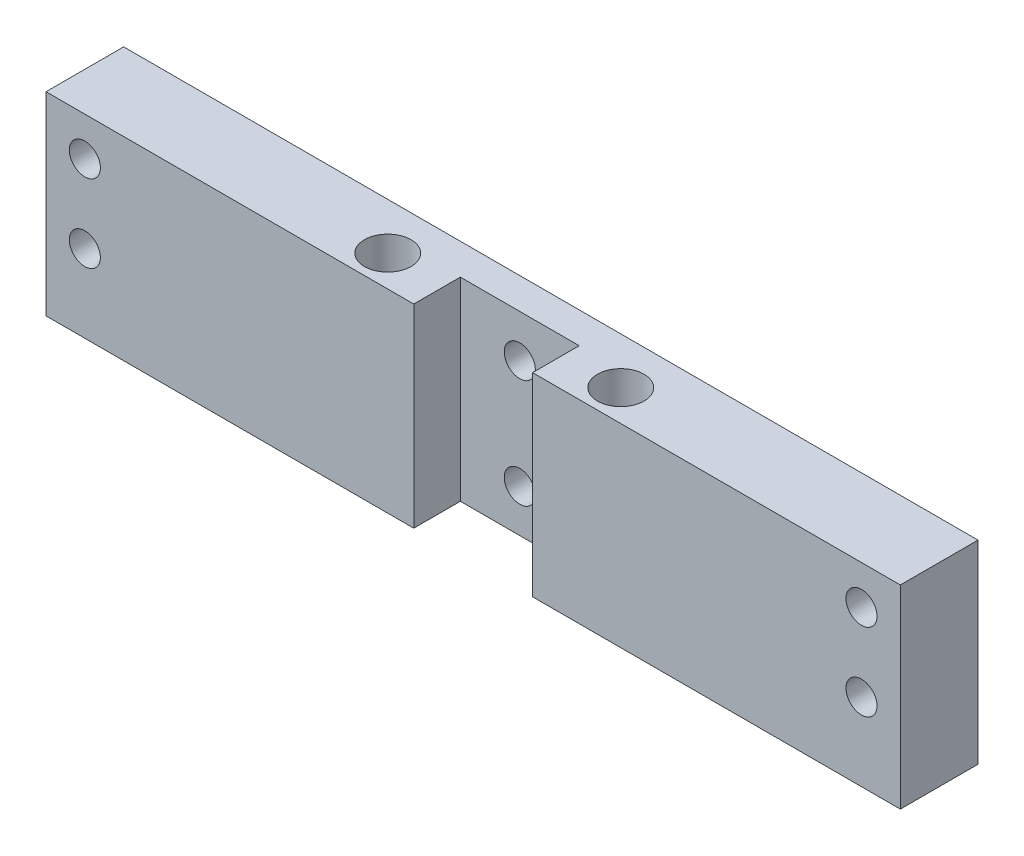
ISO-10303-21;
HEADER;
FILE_DESCRIPTION(('STEP AP214'),'2;1');
FILE_NAME('part.step','',(''),(''),'','','');
FILE_SCHEMA(('AUTOMOTIVE_DESIGN { 1 0 10303 214 1 1 1 1 }'));
ENDSEC;
DATA;
#1=APPLICATION_CONTEXT('core data for automotive mechanical design processes');
#2=APPLICATION_PROTOCOL_DEFINITION('international standard','automotive_design',2000,#1);
#3=PRODUCT_CONTEXT('',#1,'mechanical');
#4=PRODUCT('Part','Part','',(#3));
#5=PRODUCT_RELATED_PRODUCT_CATEGORY('part','',(#4));
#6=PRODUCT_DEFINITION_FORMATION('','',#4);
#7=PRODUCT_DEFINITION_CONTEXT('part definition',#1,'design');
#8=PRODUCT_DEFINITION('design','',#6,#7);
#9=PRODUCT_DEFINITION_SHAPE('','',#8);
#10=(LENGTH_UNIT() NAMED_UNIT(*) SI_UNIT(.MILLI.,.METRE.));
#11=(NAMED_UNIT(*) PLANE_ANGLE_UNIT() SI_UNIT($,.RADIAN.));
#12=(NAMED_UNIT(*) SI_UNIT($,.STERADIAN.) SOLID_ANGLE_UNIT());
#13=UNCERTAINTY_MEASURE_WITH_UNIT(LENGTH_MEASURE(1.E-05),#10,'distance_accuracy_value','');
#14=(GEOMETRIC_REPRESENTATION_CONTEXT(3) GLOBAL_UNCERTAINTY_ASSIGNED_CONTEXT((#13)) GLOBAL_UNIT_ASSIGNED_CONTEXT((#10,
#11,#12)) REPRESENTATION_CONTEXT('',''));
#15=CARTESIAN_POINT('',(0.,0.,0.));
#16=DIRECTION('',(0.,0.,1.));
#17=DIRECTION('',(1.,0.,0.));
#18=AXIS2_PLACEMENT_3D('',#15,#16,#17);
#19=CARTESIAN_POINT('',(0.,0.,10.));
#20=DIRECTION('',(0.,0.,-1.));
#21=DIRECTION('',(-1.,0.,0.));
#22=AXIS2_PLACEMENT_3D('',#19,#20,#21);
#23=PLANE('',#22);
#24=CARTESIAN_POINT('',(5.,10.,10.));
#25=DIRECTION('',(0.,0.,1.));
#26=DIRECTION('',(1.,0.,0.));
#27=AXIS2_PLACEMENT_3D('',#24,#25,#26);
#28=CIRCLE('',#27,2.);
#29=CARTESIAN_POINT('',(7.,10.,10.));
#30=VERTEX_POINT('',#29);
#31=EDGE_CURVE('E162',#30,#30,#28,.T.);
#32=ORIENTED_EDGE('',*,*,#31,.F.);
#33=EDGE_LOOP('',(#32));
#34=FACE_BOUND('',#33,.T.);
#35=CARTESIAN_POINT('',(5.,20.,10.));
#36=DIRECTION('',(0.,0.,1.));
#37=DIRECTION('',(1.,0.,0.));
#38=AXIS2_PLACEMENT_3D('',#35,#36,#37);
#39=CIRCLE('',#38,2.);
#40=CARTESIAN_POINT('',(7.,20.,10.));
#41=VERTEX_POINT('',#40);
#42=EDGE_CURVE('E168',#41,#41,#39,.T.);
#43=ORIENTED_EDGE('',*,*,#42,.F.);
#44=EDGE_LOOP('',(#43));
#45=FACE_BOUND('',#44,.T.);
#46=DIRECTION('',(1.,0.,0.));
#47=VECTOR('',#46,1.);
#48=CARTESIAN_POINT('',(0.,0.,10.));
#49=LINE('',#48,#47);
#50=CARTESIAN_POINT('',(0.,0.,10.));
#51=VERTEX_POINT('',#50);
#52=CARTESIAN_POINT('',(47.35,0.,10.));
#53=VERTEX_POINT('',#52);
#54=EDGE_CURVE('E86',#51,#53,#49,.T.);
#55=ORIENTED_EDGE('',*,*,#54,.T.);
#56=DIRECTION('',(0.,-1.,0.));
#57=VECTOR('',#56,1.);
#58=CARTESIAN_POINT('',(47.35,25.,10.));
#59=LINE('',#58,#57);
#60=CARTESIAN_POINT('',(47.35,25.,10.));
#61=VERTEX_POINT('',#60);
#62=EDGE_CURVE('E112',#61,#53,#59,.T.);
#63=ORIENTED_EDGE('',*,*,#62,.F.);
#64=DIRECTION('',(-1.,0.,0.));
#65=VECTOR('',#64,1.);
#66=CARTESIAN_POINT('',(0.,25.,10.));
#67=LINE('',#66,#65);
#68=CARTESIAN_POINT('',(0.,25.,10.));
#69=VERTEX_POINT('',#68);
#70=EDGE_CURVE('E57',#61,#69,#67,.T.);
#71=ORIENTED_EDGE('',*,*,#70,.T.);
#72=DIRECTION('',(0.,-1.,0.));
#73=VECTOR('',#72,1.);
#74=CARTESIAN_POINT('',(0.,0.,10.));
#75=LINE('',#74,#73);
#76=EDGE_CURVE('E174',#69,#51,#75,.T.);
#77=ORIENTED_EDGE('',*,*,#76,.T.);
#78=EDGE_LOOP('',(#55,#63,#71,#77));
#79=FACE_BOUND('',#78,.T.);
#80=ADVANCED_FACE('F32',(#34,#45,#79),#23,.F.);
#81=CARTESIAN_POINT('',(55.,19.5,10.));
#82=DIRECTION('',(0.,0.,-1.));
#83=DIRECTION('',(-1.,0.,0.));
#84=AXIS2_PLACEMENT_3D('',#81,#82,#83);
#85=CYLINDRICAL_SURFACE('',#84,2.);
#86=CARTESIAN_POINT('',(55.,19.5,0.));
#87=DIRECTION('',(0.,0.,1.));
#88=DIRECTION('',(1.,0.,0.));
#89=AXIS2_PLACEMENT_3D('',#86,#87,#88);
#90=CIRCLE('',#89,2.);
#91=CARTESIAN_POINT('',(57.,19.5,0.));
#92=VERTEX_POINT('',#91);
#93=EDGE_CURVE('E146',#92,#92,#90,.T.);
#94=ORIENTED_EDGE('',*,*,#93,.F.);
#95=EDGE_LOOP('',(#94));
#96=FACE_BOUND('',#95,.T.);
#97=CARTESIAN_POINT('',(55.,19.5,4.));
#98=DIRECTION('',(0.,0.,1.));
#99=DIRECTION('',(1.,0.,0.));
#100=AXIS2_PLACEMENT_3D('',#97,#98,#99);
#101=CIRCLE('',#100,2.);
#102=CARTESIAN_POINT('',(57.,19.5,4.));
#103=VERTEX_POINT('',#102);
#104=EDGE_CURVE('E140',#103,#103,#101,.T.);
#105=ORIENTED_EDGE('',*,*,#104,.T.);
#106=EDGE_LOOP('',(#105));
#107=FACE_BOUND('',#106,.T.);
#108=ADVANCED_FACE('F210',(#96,#107),#85,.F.);
#109=CARTESIAN_POINT('',(55.,5.5,10.));
#110=DIRECTION('',(0.,0.,-1.));
#111=DIRECTION('',(-1.,0.,0.));
#112=AXIS2_PLACEMENT_3D('',#109,#110,#111);
#113=CYLINDRICAL_SURFACE('',#112,2.);
#114=CARTESIAN_POINT('',(55.,5.5,0.));
#115=DIRECTION('',(0.,0.,1.));
#116=DIRECTION('',(1.,0.,0.));
#117=AXIS2_PLACEMENT_3D('',#114,#115,#116);
#118=CIRCLE('',#117,2.);
#119=CARTESIAN_POINT('',(57.,5.5,0.));
#120=VERTEX_POINT('',#119);
#121=EDGE_CURVE('E143',#120,#120,#118,.T.);
#122=ORIENTED_EDGE('',*,*,#121,.F.);
#123=EDGE_LOOP('',(#122));
#124=FACE_BOUND('',#123,.T.);
#125=CARTESIAN_POINT('',(55.,5.5,4.));
#126=DIRECTION('',(0.,0.,1.));
#127=DIRECTION('',(1.,0.,0.));
#128=AXIS2_PLACEMENT_3D('',#125,#126,#127);
#129=CIRCLE('',#128,2.);
#130=CARTESIAN_POINT('',(57.,5.5,4.));
#131=VERTEX_POINT('',#130);
#132=EDGE_CURVE('E36',#131,#131,#129,.T.);
#133=ORIENTED_EDGE('',*,*,#132,.T.);
#134=EDGE_LOOP('',(#133));
#135=FACE_BOUND('',#134,.T.);
#136=ADVANCED_FACE('F217',(#124,#135),#113,.F.);
#137=CARTESIAN_POINT('',(110.,25.,10.));
#138=VERTEX_POINT('',#137);
#139=CARTESIAN_POINT('',(62.65,25.,10.));
#140=VERTEX_POINT('',#139);
#141=EDGE_CURVE('E180',#138,#140,#67,.T.);
#142=ORIENTED_EDGE('',*,*,#141,.T.);
#143=DIRECTION('',(0.,1.,0.));
#144=VECTOR('',#143,1.);
#145=CARTESIAN_POINT('',(62.65,25.,10.));
#146=LINE('',#145,#144);
#147=CARTESIAN_POINT('',(62.65,0.,10.));
#148=VERTEX_POINT('',#147);
#149=EDGE_CURVE('E122',#148,#140,#146,.T.);
#150=ORIENTED_EDGE('',*,*,#149,.F.);
#151=CARTESIAN_POINT('',(110.,0.,10.));
#152=VERTEX_POINT('',#151);
#153=EDGE_CURVE('E176',#148,#152,#49,.T.);
#154=ORIENTED_EDGE('',*,*,#153,.T.);
#155=DIRECTION('',(0.,1.,0.));
#156=VECTOR('',#155,1.);
#157=CARTESIAN_POINT('',(110.,0.,10.));
#158=LINE('',#157,#156);
#159=EDGE_CURVE('E178',#152,#138,#158,.T.);
#160=ORIENTED_EDGE('',*,*,#159,.T.);
#161=EDGE_LOOP('',(#142,#150,#154,#160));
#162=FACE_BOUND('',#161,.T.);
#163=CARTESIAN_POINT('',(105.,20.,10.));
#164=DIRECTION('',(0.,0.,1.));
#165=DIRECTION('',(1.,0.,0.));
#166=AXIS2_PLACEMENT_3D('',#163,#164,#165);
#167=CIRCLE('',#166,2.);
#168=CARTESIAN_POINT('',(107.,20.,10.));
#169=VERTEX_POINT('',#168);
#170=EDGE_CURVE('E156',#169,#169,#167,.T.);
#171=ORIENTED_EDGE('',*,*,#170,.F.);
#172=EDGE_LOOP('',(#171));
#173=FACE_BOUND('',#172,.T.);
#174=CARTESIAN_POINT('',(105.,10.,10.));
#175=DIRECTION('',(0.,0.,1.));
#176=DIRECTION('',(1.,0.,0.));
#177=AXIS2_PLACEMENT_3D('',#174,#175,#176);
#178=CIRCLE('',#177,2.);
#179=CARTESIAN_POINT('',(107.,10.,10.));
#180=VERTEX_POINT('',#179);
#181=EDGE_CURVE('E150',#180,#180,#178,.T.);
#182=ORIENTED_EDGE('',*,*,#181,.F.);
#183=EDGE_LOOP('',(#182));
#184=FACE_BOUND('',#183,.T.);
#185=ADVANCED_FACE('F213',(#162,#173,#184),#23,.F.);
#186=CARTESIAN_POINT('',(0.,0.,0.));
#187=DIRECTION('',(0.,0.,-1.));
#188=DIRECTION('',(-1.,0.,0.));
#189=AXIS2_PLACEMENT_3D('',#186,#187,#188);
#190=PLANE('',#189);
#191=ORIENTED_EDGE('',*,*,#93,.T.);
#192=EDGE_LOOP('',(#191));
#193=FACE_BOUND('',#192,.T.);
#194=CARTESIAN_POINT('',(105.,20.,0.));
#195=DIRECTION('',(0.,0.,1.));
#196=DIRECTION('',(1.,0.,0.));
#197=AXIS2_PLACEMENT_3D('',#194,#195,#196);
#198=CIRCLE('',#197,2.);
#199=CARTESIAN_POINT('',(107.,20.,0.));
#200=VERTEX_POINT('',#199);
#201=EDGE_CURVE('E153',#200,#200,#198,.T.);
#202=ORIENTED_EDGE('',*,*,#201,.T.);
#203=EDGE_LOOP('',(#202));
#204=FACE_BOUND('',#203,.T.);
#205=CARTESIAN_POINT('',(5.,20.,0.));
#206=DIRECTION('',(0.,0.,1.));
#207=DIRECTION('',(1.,0.,0.));
#208=AXIS2_PLACEMENT_3D('',#205,#206,#207);
#209=CIRCLE('',#208,2.);
#210=CARTESIAN_POINT('',(7.,20.,0.));
#211=VERTEX_POINT('',#210);
#212=EDGE_CURVE('E165',#211,#211,#209,.T.);
#213=ORIENTED_EDGE('',*,*,#212,.T.);
#214=EDGE_LOOP('',(#213));
#215=FACE_BOUND('',#214,.T.);
#216=DIRECTION('',(0.,-1.,0.));
#217=VECTOR('',#216,1.);
#218=CARTESIAN_POINT('',(0.,0.,0.));
#219=LINE('',#218,#217);
#220=CARTESIAN_POINT('',(0.,25.,0.));
#221=VERTEX_POINT('',#220);
#222=CARTESIAN_POINT('',(0.,0.,0.));
#223=VERTEX_POINT('',#222);
#224=EDGE_CURVE('E171',#221,#223,#219,.T.);
#225=ORIENTED_EDGE('',*,*,#224,.F.);
#226=DIRECTION('',(-1.,0.,0.));
#227=VECTOR('',#226,1.);
#228=CARTESIAN_POINT('',(0.,25.,0.));
#229=LINE('',#228,#227);
#230=CARTESIAN_POINT('',(110.,25.,0.));
#231=VERTEX_POINT('',#230);
#232=EDGE_CURVE('E79',#231,#221,#229,.T.);
#233=ORIENTED_EDGE('',*,*,#232,.F.);
#234=DIRECTION('',(0.,1.,0.));
#235=VECTOR('',#234,1.);
#236=CARTESIAN_POINT('',(110.,0.,0.));
#237=LINE('',#236,#235);
#238=CARTESIAN_POINT('',(110.,0.,0.));
#239=VERTEX_POINT('',#238);
#240=EDGE_CURVE('E188',#239,#231,#237,.T.);
#241=ORIENTED_EDGE('',*,*,#240,.F.);
#242=DIRECTION('',(1.,0.,0.));
#243=VECTOR('',#242,1.);
#244=CARTESIAN_POINT('',(0.,0.,0.));
#245=LINE('',#244,#243);
#246=EDGE_CURVE('E186',#223,#239,#245,.T.);
#247=ORIENTED_EDGE('',*,*,#246,.F.);
#248=EDGE_LOOP('',(#225,#233,#241,#247));
#249=FACE_BOUND('',#248,.T.);
#250=CARTESIAN_POINT('',(5.,10.,0.));
#251=DIRECTION('',(0.,0.,1.));
#252=DIRECTION('',(1.,0.,0.));
#253=AXIS2_PLACEMENT_3D('',#250,#251,#252);
#254=CIRCLE('',#253,2.);
#255=CARTESIAN_POINT('',(7.,10.,0.));
#256=VERTEX_POINT('',#255);
#257=EDGE_CURVE('E159',#256,#256,#254,.T.);
#258=ORIENTED_EDGE('',*,*,#257,.T.);
#259=EDGE_LOOP('',(#258));
#260=FACE_BOUND('',#259,.T.);
#261=CARTESIAN_POINT('',(105.,10.,0.));
#262=DIRECTION('',(0.,0.,1.));
#263=DIRECTION('',(1.,0.,0.));
#264=AXIS2_PLACEMENT_3D('',#261,#262,#263);
#265=CIRCLE('',#264,2.);
#266=CARTESIAN_POINT('',(107.,10.,0.));
#267=VERTEX_POINT('',#266);
#268=EDGE_CURVE('E149',#267,#267,#265,.T.);
#269=ORIENTED_EDGE('',*,*,#268,.T.);
#270=EDGE_LOOP('',(#269));
#271=FACE_BOUND('',#270,.T.);
#272=ORIENTED_EDGE('',*,*,#121,.T.);
#273=EDGE_LOOP('',(#272));
#274=FACE_BOUND('',#273,.T.);
#275=ADVANCED_FACE('F203',(#193,#204,#215,#249,#260,#271,#274),#190,.T.);
#276=CARTESIAN_POINT('',(0.,0.,10.));
#277=DIRECTION('',(1.,0.,0.));
#278=DIRECTION('',(0.,0.,-1.));
#279=AXIS2_PLACEMENT_3D('',#276,#277,#278);
#280=PLANE('',#279);
#281=ORIENTED_EDGE('',*,*,#224,.T.);
#282=DIRECTION('',(0.,0.,-1.));
#283=VECTOR('',#282,1.);
#284=CARTESIAN_POINT('',(0.,0.,10.));
#285=LINE('',#284,#283);
#286=EDGE_CURVE('E11',#51,#223,#285,.T.);
#287=ORIENTED_EDGE('',*,*,#286,.F.);
#288=ORIENTED_EDGE('',*,*,#76,.F.);
#289=DIRECTION('',(0.,0.,-1.));
#290=VECTOR('',#289,1.);
#291=CARTESIAN_POINT('',(0.,25.,10.));
#292=LINE('',#291,#290);
#293=EDGE_CURVE('E183',#69,#221,#292,.T.);
#294=ORIENTED_EDGE('',*,*,#293,.T.);
#295=EDGE_LOOP('',(#281,#287,#288,#294));
#296=FACE_BOUND('',#295,.T.);
#297=ADVANCED_FACE('F34',(#296),#280,.F.);
#298=CARTESIAN_POINT('',(0.,0.,10.));
#299=DIRECTION('',(0.,1.,0.));
#300=DIRECTION('',(-1.,0.,0.));
#301=AXIS2_PLACEMENT_3D('',#298,#299,#300);
#302=PLANE('',#301);
#303=DIRECTION('',(1.,0.,0.));
#304=VECTOR('',#303,1.);
#305=CARTESIAN_POINT('',(47.35,0.,4.));
#306=LINE('',#305,#304);
#307=CARTESIAN_POINT('',(47.35,0.,4.));
#308=VERTEX_POINT('',#307);
#309=CARTESIAN_POINT('',(62.65,0.,4.));
#310=VERTEX_POINT('',#309);
#311=EDGE_CURVE('E118',#308,#310,#306,.T.);
#312=ORIENTED_EDGE('',*,*,#311,.F.);
#313=DIRECTION('',(0.,0.,1.));
#314=VECTOR('',#313,1.);
#315=CARTESIAN_POINT('',(47.35,0.,4.));
#316=LINE('',#315,#314);
#317=EDGE_CURVE('E108',#308,#53,#316,.T.);
#318=ORIENTED_EDGE('',*,*,#317,.T.);
#319=ORIENTED_EDGE('',*,*,#54,.F.);
#320=ORIENTED_EDGE('',*,*,#286,.T.);
#321=ORIENTED_EDGE('',*,*,#246,.T.);
#322=DIRECTION('',(0.,0.,-1.));
#323=VECTOR('',#322,1.);
#324=CARTESIAN_POINT('',(110.,0.,10.));
#325=LINE('',#324,#323);
#326=EDGE_CURVE('E41',#152,#239,#325,.T.);
#327=ORIENTED_EDGE('',*,*,#326,.F.);
#328=ORIENTED_EDGE('',*,*,#153,.F.);
#329=DIRECTION('',(0.,0.,1.));
#330=VECTOR('',#329,1.);
#331=CARTESIAN_POINT('',(62.65,0.,4.));
#332=LINE('',#331,#330);
#333=EDGE_CURVE('E114',#310,#148,#332,.T.);
#334=ORIENTED_EDGE('',*,*,#333,.F.);
#335=EDGE_LOOP('',(#312,#318,#319,#320,#321,#327,#328,#334));
#336=FACE_BOUND('',#335,.T.);
#337=ADVANCED_FACE('F124',(#336),#302,.F.);
#338=CARTESIAN_POINT('',(110.,0.,10.));
#339=DIRECTION('',(-1.,0.,0.));
#340=DIRECTION('',(0.,-1.,0.));
#341=AXIS2_PLACEMENT_3D('',#338,#339,#340);
#342=PLANE('',#341);
#343=ORIENTED_EDGE('',*,*,#240,.T.);
#344=DIRECTION('',(0.,0.,-1.));
#345=VECTOR('',#344,1.);
#346=CARTESIAN_POINT('',(110.,25.,10.));
#347=LINE('',#346,#345);
#348=EDGE_CURVE('E192',#138,#231,#347,.T.);
#349=ORIENTED_EDGE('',*,*,#348,.F.);
#350=ORIENTED_EDGE('',*,*,#159,.F.);
#351=ORIENTED_EDGE('',*,*,#326,.T.);
#352=EDGE_LOOP('',(#343,#349,#350,#351));
#353=FACE_BOUND('',#352,.T.);
#354=ADVANCED_FACE('F199',(#353),#342,.F.);
#355=CARTESIAN_POINT('',(0.,25.,10.));
#356=DIRECTION('',(0.,-1.,0.));
#357=DIRECTION('',(1.,0.,0.));
#358=AXIS2_PLACEMENT_3D('',#355,#356,#357);
#359=PLANE('',#358);
#360=CARTESIAN_POINT('',(40.,25.,6.));
#361=DIRECTION('',(0.,1.,0.));
#362=DIRECTION('',(-1.,0.,0.));
#363=AXIS2_PLACEMENT_3D('',#360,#361,#362);
#364=CIRCLE('',#363,3.);
#365=CARTESIAN_POINT('',(37.,25.,6.));
#366=VERTEX_POINT('',#365);
#367=EDGE_CURVE('E413',#366,#366,#364,.T.);
#368=ORIENTED_EDGE('',*,*,#367,.F.);
#369=EDGE_LOOP('',(#368));
#370=FACE_BOUND('',#369,.T.);
#371=CARTESIAN_POINT('',(70.,25.,6.));
#372=DIRECTION('',(0.,1.,0.));
#373=DIRECTION('',(-1.,0.,0.));
#374=AXIS2_PLACEMENT_3D('',#371,#372,#373);
#375=CIRCLE('',#374,3.00000000000001);
#376=CARTESIAN_POINT('',(67.,25.,6.));
#377=VERTEX_POINT('',#376);
#378=EDGE_CURVE('E412',#377,#377,#375,.T.);
#379=ORIENTED_EDGE('',*,*,#378,.F.);
#380=EDGE_LOOP('',(#379));
#381=FACE_BOUND('',#380,.T.);
#382=ORIENTED_EDGE('',*,*,#70,.F.);
#383=DIRECTION('',(0.,0.,1.));
#384=VECTOR('',#383,1.);
#385=CARTESIAN_POINT('',(47.35,25.,4.));
#386=LINE('',#385,#384);
#387=CARTESIAN_POINT('',(47.35,25.,4.));
#388=VERTEX_POINT('',#387);
#389=EDGE_CURVE('E134',#388,#61,#386,.T.);
#390=ORIENTED_EDGE('',*,*,#389,.F.);
#391=DIRECTION('',(-1.,0.,0.));
#392=VECTOR('',#391,1.);
#393=CARTESIAN_POINT('',(47.35,25.,4.));
#394=LINE('',#393,#392);
#395=CARTESIAN_POINT('',(62.65,25.,4.));
#396=VERTEX_POINT('',#395);
#397=EDGE_CURVE('E115',#396,#388,#394,.T.);
#398=ORIENTED_EDGE('',*,*,#397,.F.);
#399=DIRECTION('',(0.,0.,1.));
#400=VECTOR('',#399,1.);
#401=CARTESIAN_POINT('',(62.65,25.,4.));
#402=LINE('',#401,#400);
#403=EDGE_CURVE('E136',#396,#140,#402,.T.);
#404=ORIENTED_EDGE('',*,*,#403,.T.);
#405=ORIENTED_EDGE('',*,*,#141,.F.);
#406=ORIENTED_EDGE('',*,*,#348,.T.);
#407=ORIENTED_EDGE('',*,*,#232,.T.);
#408=ORIENTED_EDGE('',*,*,#293,.F.);
#409=EDGE_LOOP('',(#382,#390,#398,#404,#405,#406,#407,#408));
#410=FACE_BOUND('',#409,.T.);
#411=ADVANCED_FACE('F208',(#370,#381,#410),#359,.F.);
#412=CARTESIAN_POINT('',(5.,20.,10.));
#413=DIRECTION('',(0.,0.,-1.));
#414=DIRECTION('',(-1.,0.,0.));
#415=AXIS2_PLACEMENT_3D('',#412,#413,#414);
#416=CYLINDRICAL_SURFACE('',#415,2.);
#417=ORIENTED_EDGE('',*,*,#42,.T.);
#418=EDGE_LOOP('',(#417));
#419=FACE_BOUND('',#418,.T.);
#420=ORIENTED_EDGE('',*,*,#212,.F.);
#421=EDGE_LOOP('',(#420));
#422=FACE_BOUND('',#421,.T.);
#423=ADVANCED_FACE('F277',(#419,#422),#416,.F.);
#424=CARTESIAN_POINT('',(5.,10.,10.));
#425=DIRECTION('',(0.,0.,-1.));
#426=DIRECTION('',(-1.,0.,0.));
#427=AXIS2_PLACEMENT_3D('',#424,#425,#426);
#428=CYLINDRICAL_SURFACE('',#427,2.);
#429=ORIENTED_EDGE('',*,*,#31,.T.);
#430=EDGE_LOOP('',(#429));
#431=FACE_BOUND('',#430,.T.);
#432=ORIENTED_EDGE('',*,*,#257,.F.);
#433=EDGE_LOOP('',(#432));
#434=FACE_BOUND('',#433,.T.);
#435=ADVANCED_FACE('F274',(#431,#434),#428,.F.);
#436=CARTESIAN_POINT('',(105.,20.,10.));
#437=DIRECTION('',(0.,0.,-1.));
#438=DIRECTION('',(-1.,0.,0.));
#439=AXIS2_PLACEMENT_3D('',#436,#437,#438);
#440=CYLINDRICAL_SURFACE('',#439,2.);
#441=ORIENTED_EDGE('',*,*,#170,.T.);
#442=EDGE_LOOP('',(#441));
#443=FACE_BOUND('',#442,.T.);
#444=ORIENTED_EDGE('',*,*,#201,.F.);
#445=EDGE_LOOP('',(#444));
#446=FACE_BOUND('',#445,.T.);
#447=ADVANCED_FACE('F243',(#443,#446),#440,.F.);
#448=CARTESIAN_POINT('',(105.,10.,10.));
#449=DIRECTION('',(0.,0.,-1.));
#450=DIRECTION('',(-1.,0.,0.));
#451=AXIS2_PLACEMENT_3D('',#448,#449,#450);
#452=CYLINDRICAL_SURFACE('',#451,2.);
#453=ORIENTED_EDGE('',*,*,#181,.T.);
#454=EDGE_LOOP('',(#453));
#455=FACE_BOUND('',#454,.T.);
#456=ORIENTED_EDGE('',*,*,#268,.F.);
#457=EDGE_LOOP('',(#456));
#458=FACE_BOUND('',#457,.T.);
#459=ADVANCED_FACE('F240',(#455,#458),#452,.F.);
#460=CARTESIAN_POINT('',(47.35,25.,4.));
#461=DIRECTION('',(-1.,0.,0.));
#462=DIRECTION('',(0.,0.,1.));
#463=AXIS2_PLACEMENT_3D('',#460,#461,#462);
#464=PLANE('',#463);
#465=ORIENTED_EDGE('',*,*,#62,.T.);
#466=ORIENTED_EDGE('',*,*,#317,.F.);
#467=DIRECTION('',(0.,-1.,0.));
#468=VECTOR('',#467,1.);
#469=CARTESIAN_POINT('',(47.35,25.,4.));
#470=LINE('',#469,#468);
#471=EDGE_CURVE('E111',#388,#308,#470,.T.);
#472=ORIENTED_EDGE('',*,*,#471,.F.);
#473=ORIENTED_EDGE('',*,*,#389,.T.);
#474=EDGE_LOOP('',(#465,#466,#472,#473));
#475=FACE_BOUND('',#474,.T.);
#476=ADVANCED_FACE('F110',(#475),#464,.F.);
#477=CARTESIAN_POINT('',(62.65,25.,4.));
#478=DIRECTION('',(1.,0.,0.));
#479=DIRECTION('',(0.,0.,-1.));
#480=AXIS2_PLACEMENT_3D('',#477,#478,#479);
#481=PLANE('',#480);
#482=ORIENTED_EDGE('',*,*,#149,.T.);
#483=ORIENTED_EDGE('',*,*,#403,.F.);
#484=DIRECTION('',(0.,1.,0.));
#485=VECTOR('',#484,1.);
#486=CARTESIAN_POINT('',(62.65,25.,4.));
#487=LINE('',#486,#485);
#488=EDGE_CURVE('E48',#310,#396,#487,.T.);
#489=ORIENTED_EDGE('',*,*,#488,.F.);
#490=ORIENTED_EDGE('',*,*,#333,.T.);
#491=EDGE_LOOP('',(#482,#483,#489,#490));
#492=FACE_BOUND('',#491,.T.);
#493=ADVANCED_FACE('F255',(#492),#481,.F.);
#494=CARTESIAN_POINT('',(0.,0.,4.));
#495=DIRECTION('',(0.,0.,1.));
#496=DIRECTION('',(1.,0.,0.));
#497=AXIS2_PLACEMENT_3D('',#494,#495,#496);
#498=PLANE('',#497);
#499=ORIENTED_EDGE('',*,*,#104,.F.);
#500=EDGE_LOOP('',(#499));
#501=FACE_BOUND('',#500,.T.);
#502=ORIENTED_EDGE('',*,*,#132,.F.);
#503=EDGE_LOOP('',(#502));
#504=FACE_BOUND('',#503,.T.);
#505=ORIENTED_EDGE('',*,*,#471,.T.);
#506=ORIENTED_EDGE('',*,*,#311,.T.);
#507=ORIENTED_EDGE('',*,*,#488,.T.);
#508=ORIENTED_EDGE('',*,*,#397,.T.);
#509=EDGE_LOOP('',(#505,#506,#507,#508));
#510=FACE_BOUND('',#509,.T.);
#511=ADVANCED_FACE('F117',(#501,#504,#510),#498,.T.);
#512=CARTESIAN_POINT('',(70.,10.,6.));
#513=DIRECTION('',(0.,1.,0.));
#514=DIRECTION('',(-1.,0.,0.));
#515=AXIS2_PLACEMENT_3D('',#512,#513,#514);
#516=CYLINDRICAL_SURFACE('',#515,3.00000000000001);
#517=CARTESIAN_POINT('',(70.,10.,6.));
#518=DIRECTION('',(0.,1.,0.));
#519=DIRECTION('',(-1.,0.,0.));
#520=AXIS2_PLACEMENT_3D('',#517,#518,#519);
#521=CIRCLE('',#520,3.00000000000001);
#522=CARTESIAN_POINT('',(67.,10.,6.));
#523=VERTEX_POINT('',#522);
#524=EDGE_CURVE('E132',#523,#523,#521,.T.);
#525=ORIENTED_EDGE('',*,*,#524,.F.);
#526=EDGE_LOOP('',(#525));
#527=FACE_BOUND('',#526,.T.);
#528=ORIENTED_EDGE('',*,*,#378,.T.);
#529=EDGE_LOOP('',(#528));
#530=FACE_BOUND('',#529,.T.);
#531=ADVANCED_FACE('F254',(#527,#530),#516,.F.);
#532=CARTESIAN_POINT('',(70.,10.,6.));
#533=DIRECTION('',(0.,1.,0.));
#534=DIRECTION('',(-1.,0.,0.));
#535=AXIS2_PLACEMENT_3D('',#532,#533,#534);
#536=PLANE('',#535);
#537=ORIENTED_EDGE('',*,*,#524,.T.);
#538=EDGE_LOOP('',(#537));
#539=FACE_BOUND('',#538,.T.);
#540=ADVANCED_FACE('F262',(#539),#536,.T.);
#541=CARTESIAN_POINT('',(40.,10.,6.));
#542=DIRECTION('',(0.,1.,0.));
#543=DIRECTION('',(-1.,0.,0.));
#544=AXIS2_PLACEMENT_3D('',#541,#542,#543);
#545=CYLINDRICAL_SURFACE('',#544,3.);
#546=CARTESIAN_POINT('',(40.,10.,6.));
#547=DIRECTION('',(0.,1.,0.));
#548=DIRECTION('',(-1.,0.,0.));
#549=AXIS2_PLACEMENT_3D('',#546,#547,#548);
#550=CIRCLE('',#549,3.);
#551=CARTESIAN_POINT('',(37.,10.,6.));
#552=VERTEX_POINT('',#551);
#553=EDGE_CURVE('E411',#552,#552,#550,.T.);
#554=ORIENTED_EDGE('',*,*,#553,.F.);
#555=EDGE_LOOP('',(#554));
#556=FACE_BOUND('',#555,.T.);
#557=ORIENTED_EDGE('',*,*,#367,.T.);
#558=EDGE_LOOP('',(#557));
#559=FACE_BOUND('',#558,.T.);
#560=ADVANCED_FACE('F386',(#556,#559),#545,.F.);
#561=CARTESIAN_POINT('',(40.,10.,6.));
#562=DIRECTION('',(0.,1.,0.));
#563=DIRECTION('',(-1.,0.,0.));
#564=AXIS2_PLACEMENT_3D('',#561,#562,#563);
#565=PLANE('',#564);
#566=ORIENTED_EDGE('',*,*,#553,.T.);
#567=EDGE_LOOP('',(#566));
#568=FACE_BOUND('',#567,.T.);
#569=ADVANCED_FACE('F394',(#568),#565,.T.);
#570=CLOSED_SHELL('',(#80,#108,#136,#185,#275,#297,#337,#354,#411,#423,#435,#447,#459,#476,#493,
#511,#531,#540,#560,#569));
#571=MANIFOLD_SOLID_BREP('B2',#570);
#572=ADVANCED_BREP_SHAPE_REPRESENTATION('',(#18,#571),#14);
#573=SHAPE_DEFINITION_REPRESENTATION(#9,#572);
ENDSEC;
END-ISO-10303-21;
